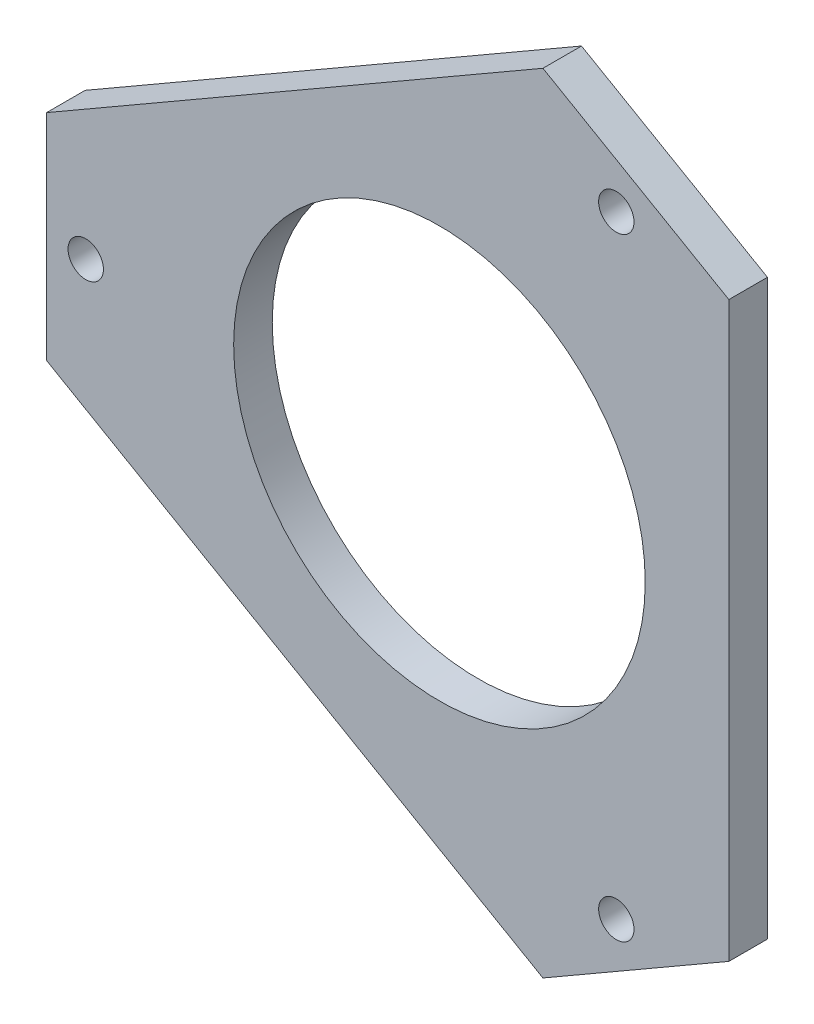
ISO-10303-21;
HEADER;
FILE_DESCRIPTION(('STEP AP214'),'2;1');
FILE_NAME('part.step','',(''),(''),'','','');
FILE_SCHEMA(('AUTOMOTIVE_DESIGN { 1 0 10303 214 1 1 1 1 }'));
ENDSEC;
DATA;
#1=APPLICATION_CONTEXT('core data for automotive mechanical design processes');
#2=APPLICATION_PROTOCOL_DEFINITION('international standard','automotive_design',2000,#1);
#3=PRODUCT_CONTEXT('',#1,'mechanical');
#4=PRODUCT('Part','Part','',(#3));
#5=PRODUCT_RELATED_PRODUCT_CATEGORY('part','',(#4));
#6=PRODUCT_DEFINITION_FORMATION('','',#4);
#7=PRODUCT_DEFINITION_CONTEXT('part definition',#1,'design');
#8=PRODUCT_DEFINITION('design','',#6,#7);
#9=PRODUCT_DEFINITION_SHAPE('','',#8);
#10=(LENGTH_UNIT() NAMED_UNIT(*) SI_UNIT(.MILLI.,.METRE.));
#11=(NAMED_UNIT(*) PLANE_ANGLE_UNIT() SI_UNIT($,.RADIAN.));
#12=(NAMED_UNIT(*) SI_UNIT($,.STERADIAN.) SOLID_ANGLE_UNIT());
#13=UNCERTAINTY_MEASURE_WITH_UNIT(LENGTH_MEASURE(1.E-05),#10,'distance_accuracy_value','');
#14=(GEOMETRIC_REPRESENTATION_CONTEXT(3) GLOBAL_UNCERTAINTY_ASSIGNED_CONTEXT((#13)) GLOBAL_UNIT_ASSIGNED_CONTEXT((#10,
#11,#12)) REPRESENTATION_CONTEXT('',''));
#15=CARTESIAN_POINT('',(0.,0.,0.));
#16=DIRECTION('',(0.,0.,1.));
#17=DIRECTION('',(1.,0.,0.));
#18=AXIS2_PLACEMENT_3D('',#15,#16,#17);
#19=CARTESIAN_POINT('',(-61.0910180612027,16.6906085043633,16.));
#20=DIRECTION('',(0.,0.,-1.));
#21=DIRECTION('',(-1.00000000000001,0.,0.));
#22=AXIS2_PLACEMENT_3D('',#19,#20,#21);
#23=PLANE('',#22);
#24=CARTESIAN_POINT('',(27.4999999999997,47.6313972081436,16.));
#25=DIRECTION('',(0.,0.,1.));
#26=DIRECTION('',(1.00000000000001,0.,0.));
#27=AXIS2_PLACEMENT_3D('',#24,#25,#26);
#28=CIRCLE('',#27,2.74999999999999);
#29=CARTESIAN_POINT('',(30.2499999999997,47.6313972081436,16.));
#30=VERTEX_POINT('',#29);
#31=EDGE_CURVE('E208',#30,#30,#28,.T.);
#32=ORIENTED_EDGE('',*,*,#31,.F.);
#33=EDGE_LOOP('',(#32));
#34=FACE_BOUND('',#33,.T.);
#35=CARTESIAN_POINT('',(0.,0.,16.));
#36=DIRECTION('',(0.,0.,1.));
#37=DIRECTION('',(1.00000000000001,0.,0.));
#38=AXIS2_PLACEMENT_3D('',#35,#36,#37);
#39=CIRCLE('',#38,32.);
#40=CARTESIAN_POINT('',(32.0000000000003,0.,16.));
#41=VERTEX_POINT('',#40);
#42=EDGE_CURVE('E145',#41,#41,#39,.T.);
#43=ORIENTED_EDGE('',*,*,#42,.F.);
#44=EDGE_LOOP('',(#43));
#45=FACE_BOUND('',#44,.T.);
#46=DIRECTION('',(0.,1.,0.));
#47=VECTOR('',#46,1.);
#48=CARTESIAN_POINT('',(-61.0910180612026,-16.6906085043628,16.));
#49=LINE('',#48,#47);
#50=CARTESIAN_POINT('',(-61.0910180612026,-16.6906085043628,16.));
#51=VERTEX_POINT('',#50);
#52=CARTESIAN_POINT('',(-61.0910180612027,16.6906085043633,16.));
#53=VERTEX_POINT('',#52);
#54=EDGE_CURVE('E156',#51,#53,#49,.T.);
#55=ORIENTED_EDGE('',*,*,#54,.F.);
#56=DIRECTION('',(-0.866025403784449,0.500000000000003,0.));
#57=VECTOR('',#56,1.);
#58=CARTESIAN_POINT('',(16.0910180612025,-61.2516778362366,15.9999999999995));
#59=LINE('',#58,#57);
#60=CARTESIAN_POINT('',(16.0910180612025,-61.2516778362366,15.9999999999995));
#61=VERTEX_POINT('',#60);
#62=EDGE_CURVE('E131',#61,#51,#59,.T.);
#63=ORIENTED_EDGE('',*,*,#62,.F.);
#64=DIRECTION('',(-0.866025403784444,-0.499999999999997,0.));
#65=VECTOR('',#64,1.);
#66=CARTESIAN_POINT('',(45.0000000000006,-44.5610693318735,16.));
#67=LINE('',#66,#65);
#68=CARTESIAN_POINT('',(45.0000000000006,-44.5610693318735,16.));
#69=VERTEX_POINT('',#68);
#70=EDGE_CURVE('E116',#69,#61,#67,.T.);
#71=ORIENTED_EDGE('',*,*,#70,.F.);
#72=DIRECTION('',(0.,-1.,0.));
#73=VECTOR('',#72,1.);
#74=CARTESIAN_POINT('',(45.0000000000004,44.5610693318734,16.0000000000005));
#75=LINE('',#74,#73);
#76=CARTESIAN_POINT('',(45.0000000000004,44.5610693318734,16.0000000000005));
#77=VERTEX_POINT('',#76);
#78=EDGE_CURVE('E129',#77,#69,#75,.T.);
#79=ORIENTED_EDGE('',*,*,#78,.F.);
#80=DIRECTION('',(0.866025403784453,-0.499999999999995,0.));
#81=VECTOR('',#80,1.);
#82=CARTESIAN_POINT('',(16.0910180612018,61.2516778362363,15.9999999999995));
#83=LINE('',#82,#81);
#84=CARTESIAN_POINT('',(16.0910180612018,61.2516778362363,15.9999999999995));
#85=VERTEX_POINT('',#84);
#86=EDGE_CURVE('E134',#85,#77,#83,.T.);
#87=ORIENTED_EDGE('',*,*,#86,.F.);
#88=DIRECTION('',(0.866025403784445,0.499999999999998,0.));
#89=VECTOR('',#88,1.);
#90=CARTESIAN_POINT('',(-61.0910180612027,16.6906085043633,16.));
#91=LINE('',#90,#89);
#92=EDGE_CURVE('E136',#53,#85,#91,.T.);
#93=ORIENTED_EDGE('',*,*,#92,.F.);
#94=EDGE_LOOP('',(#55,#63,#71,#79,#87,#93));
#95=FACE_BOUND('',#94,.T.);
#96=CARTESIAN_POINT('',(27.5000000000002,-47.6313972081436,16.));
#97=DIRECTION('',(0.,0.,1.));
#98=DIRECTION('',(1.00000000000001,0.,0.));
#99=AXIS2_PLACEMENT_3D('',#96,#97,#98);
#100=CIRCLE('',#99,2.74999999999999);
#101=CARTESIAN_POINT('',(30.2500000000002,-47.6313972081436,16.));
#102=VERTEX_POINT('',#101);
#103=EDGE_CURVE('E217',#102,#102,#100,.T.);
#104=ORIENTED_EDGE('',*,*,#103,.F.);
#105=EDGE_LOOP('',(#104));
#106=FACE_BOUND('',#105,.T.);
#107=CARTESIAN_POINT('',(-54.9999999999999,1.66533453693773E-13,16.));
#108=DIRECTION('',(0.,0.,1.));
#109=DIRECTION('',(1.00000000000001,0.,0.));
#110=AXIS2_PLACEMENT_3D('',#107,#108,#109);
#111=CIRCLE('',#110,2.74999999999999);
#112=CARTESIAN_POINT('',(-52.2499999999999,1.59205981731247E-13,16.));
#113=VERTEX_POINT('',#112);
#114=EDGE_CURVE('E204',#113,#113,#111,.T.);
#115=ORIENTED_EDGE('',*,*,#114,.F.);
#116=EDGE_LOOP('',(#115));
#117=FACE_BOUND('',#116,.T.);
#118=ADVANCED_FACE('F55',(#34,#45,#95,#106,#117),#23,.F.);
#119=CARTESIAN_POINT('',(-61.0910180612026,16.6906085043632,9.99999999999954));
#120=DIRECTION('',(0.,0.,-1.));
#121=DIRECTION('',(-1.00000000000001,0.,0.));
#122=AXIS2_PLACEMENT_3D('',#119,#120,#121);
#123=PLANE('',#122);
#124=CARTESIAN_POINT('',(-54.9999999999997,-1.11022302462516E-13,10.));
#125=DIRECTION('',(0.,0.,-1.));
#126=DIRECTION('',(-1.00000000000001,0.,0.));
#127=AXIS2_PLACEMENT_3D('',#124,#125,#126);
#128=CIRCLE('',#127,2.74999999999999);
#129=CARTESIAN_POINT('',(-57.7499999999998,-1.0369483049999E-13,10.));
#130=VERTEX_POINT('',#129);
#131=EDGE_CURVE('E207',#130,#130,#128,.T.);
#132=ORIENTED_EDGE('',*,*,#131,.F.);
#133=EDGE_LOOP('',(#132));
#134=FACE_BOUND('',#133,.T.);
#135=CARTESIAN_POINT('',(27.4999999999996,47.6313972081436,10.));
#136=DIRECTION('',(0.,0.,-1.));
#137=DIRECTION('',(-1.00000000000001,0.,0.));
#138=AXIS2_PLACEMENT_3D('',#135,#136,#137);
#139=CIRCLE('',#138,2.74999999999999);
#140=CARTESIAN_POINT('',(24.7499999999995,47.6313972081436,10.));
#141=VERTEX_POINT('',#140);
#142=EDGE_CURVE('E211',#141,#141,#139,.T.);
#143=ORIENTED_EDGE('',*,*,#142,.F.);
#144=EDGE_LOOP('',(#143));
#145=FACE_BOUND('',#144,.T.);
#146=CARTESIAN_POINT('',(27.5000000000002,-47.6313972081434,10.));
#147=DIRECTION('',(0.,0.,-1.));
#148=DIRECTION('',(-1.00000000000001,0.,0.));
#149=AXIS2_PLACEMENT_3D('',#146,#147,#148);
#150=CIRCLE('',#149,2.74999999999999);
#151=CARTESIAN_POINT('',(24.7500000000002,-47.6313972081434,10.));
#152=VERTEX_POINT('',#151);
#153=EDGE_CURVE('E220',#152,#152,#150,.T.);
#154=ORIENTED_EDGE('',*,*,#153,.F.);
#155=EDGE_LOOP('',(#154));
#156=FACE_BOUND('',#155,.T.);
#157=DIRECTION('',(0.,1.,0.));
#158=VECTOR('',#157,1.);
#159=CARTESIAN_POINT('',(-61.0910180612025,-16.6906085043628,10.));
#160=LINE('',#159,#158);
#161=CARTESIAN_POINT('',(-61.0910180612025,-16.6906085043628,10.));
#162=VERTEX_POINT('',#161);
#163=CARTESIAN_POINT('',(-61.0910180612026,16.6906085043632,9.99999999999954));
#164=VERTEX_POINT('',#163);
#165=EDGE_CURVE('E141',#162,#164,#160,.T.);
#166=ORIENTED_EDGE('',*,*,#165,.T.);
#167=DIRECTION('',(0.866025403784445,0.499999999999998,0.));
#168=VECTOR('',#167,1.);
#169=CARTESIAN_POINT('',(-61.0910180612026,16.6906085043632,9.99999999999954));
#170=LINE('',#169,#168);
#171=CARTESIAN_POINT('',(16.0910180612017,61.2516778362363,9.99999999999954));
#172=VERTEX_POINT('',#171);
#173=EDGE_CURVE('E144',#164,#172,#170,.T.);
#174=ORIENTED_EDGE('',*,*,#173,.T.);
#175=DIRECTION('',(0.866025403784453,-0.499999999999995,0.));
#176=VECTOR('',#175,1.);
#177=CARTESIAN_POINT('',(16.0910180612017,61.2516778362363,9.99999999999954));
#178=LINE('',#177,#176);
#179=CARTESIAN_POINT('',(45.0000000000003,44.5610693318735,10.0000000000005));
#180=VERTEX_POINT('',#179);
#181=EDGE_CURVE('E148',#172,#180,#178,.T.);
#182=ORIENTED_EDGE('',*,*,#181,.T.);
#183=DIRECTION('',(0.,-1.,0.));
#184=VECTOR('',#183,1.);
#185=CARTESIAN_POINT('',(45.0000000000003,44.5610693318735,10.0000000000005));
#186=LINE('',#185,#184);
#187=CARTESIAN_POINT('',(45.0000000000007,-44.5610693318734,9.99999999999995));
#188=VERTEX_POINT('',#187);
#189=EDGE_CURVE('E151',#180,#188,#186,.T.);
#190=ORIENTED_EDGE('',*,*,#189,.T.);
#191=DIRECTION('',(-0.866025403784444,-0.499999999999997,0.));
#192=VECTOR('',#191,1.);
#193=CARTESIAN_POINT('',(45.0000000000007,-44.5610693318734,9.99999999999995));
#194=LINE('',#193,#192);
#195=CARTESIAN_POINT('',(16.0910180612025,-61.2516778362367,9.99999999999954));
#196=VERTEX_POINT('',#195);
#197=EDGE_CURVE('E118',#188,#196,#194,.T.);
#198=ORIENTED_EDGE('',*,*,#197,.T.);
#199=DIRECTION('',(-0.866025403784449,0.500000000000003,0.));
#200=VECTOR('',#199,1.);
#201=CARTESIAN_POINT('',(16.0910180612025,-61.2516778362367,9.99999999999954));
#202=LINE('',#201,#200);
#203=EDGE_CURVE('E154',#196,#162,#202,.T.);
#204=ORIENTED_EDGE('',*,*,#203,.T.);
#205=EDGE_LOOP('',(#166,#174,#182,#190,#198,#204));
#206=FACE_BOUND('',#205,.T.);
#207=CARTESIAN_POINT('',(0.,0.,10.));
#208=DIRECTION('',(0.,0.,1.));
#209=DIRECTION('',(1.00000000000001,0.,0.));
#210=AXIS2_PLACEMENT_3D('',#207,#208,#209);
#211=CIRCLE('',#210,32.);
#212=CARTESIAN_POINT('',(32.0000000000003,-1.26898491714655E-13,10.));
#213=VERTEX_POINT('',#212);
#214=EDGE_CURVE('E223',#213,#213,#211,.T.);
#215=ORIENTED_EDGE('',*,*,#214,.T.);
#216=EDGE_LOOP('',(#215));
#217=FACE_BOUND('',#216,.T.);
#218=ADVANCED_FACE('F163',(#134,#145,#156,#206,#217),#123,.T.);
#219=CARTESIAN_POINT('',(-61.0910180612026,-16.6906085043628,16.));
#220=DIRECTION('',(-1.00000000000001,0.,0.));
#221=DIRECTION('',(0.,0.,1.));
#222=AXIS2_PLACEMENT_3D('',#219,#220,#221);
#223=PLANE('',#222);
#224=ORIENTED_EDGE('',*,*,#165,.F.);
#225=DIRECTION('',(0.,0.,-1.));
#226=VECTOR('',#225,1.);
#227=CARTESIAN_POINT('',(-61.0910180612026,-16.6906085043628,16.));
#228=LINE('',#227,#226);
#229=EDGE_CURVE('E12',#51,#162,#228,.T.);
#230=ORIENTED_EDGE('',*,*,#229,.F.);
#231=ORIENTED_EDGE('',*,*,#54,.T.);
#232=DIRECTION('',(0.,0.,-1.));
#233=VECTOR('',#232,1.);
#234=CARTESIAN_POINT('',(-61.0910180612027,16.6906085043633,16.));
#235=LINE('',#234,#233);
#236=EDGE_CURVE('E59',#53,#164,#235,.T.);
#237=ORIENTED_EDGE('',*,*,#236,.T.);
#238=EDGE_LOOP('',(#224,#230,#231,#237));
#239=FACE_BOUND('',#238,.T.);
#240=ADVANCED_FACE('F57',(#239),#223,.T.);
#241=CARTESIAN_POINT('',(16.0910180612025,-61.2516778362366,15.9999999999995));
#242=DIRECTION('',(-0.500000000000003,-0.866025403784437,0.));
#243=DIRECTION('',(0.866025403784449,-0.500000000000003,0.));
#244=AXIS2_PLACEMENT_3D('',#241,#242,#243);
#245=PLANE('',#244);
#246=ORIENTED_EDGE('',*,*,#203,.F.);
#247=DIRECTION('',(0.,0.,-1.));
#248=VECTOR('',#247,1.);
#249=CARTESIAN_POINT('',(16.0910180612025,-61.2516778362366,15.9999999999995));
#250=LINE('',#249,#248);
#251=EDGE_CURVE('E65',#61,#196,#250,.T.);
#252=ORIENTED_EDGE('',*,*,#251,.F.);
#253=ORIENTED_EDGE('',*,*,#62,.T.);
#254=ORIENTED_EDGE('',*,*,#229,.T.);
#255=EDGE_LOOP('',(#246,#252,#253,#254));
#256=FACE_BOUND('',#255,.T.);
#257=ADVANCED_FACE('F165',(#256),#245,.T.);
#258=CARTESIAN_POINT('',(45.0000000000006,-44.5610693318735,16.));
#259=DIRECTION('',(0.500000000000007,-0.866025403784441,0.));
#260=DIRECTION('',(0.866025403784445,0.499999999999997,0.));
#261=AXIS2_PLACEMENT_3D('',#258,#259,#260);
#262=PLANE('',#261);
#263=ORIENTED_EDGE('',*,*,#197,.F.);
#264=DIRECTION('',(0.,0.,-1.));
#265=VECTOR('',#264,1.);
#266=CARTESIAN_POINT('',(45.0000000000006,-44.5610693318735,16.));
#267=LINE('',#266,#265);
#268=EDGE_CURVE('E113',#69,#188,#267,.T.);
#269=ORIENTED_EDGE('',*,*,#268,.F.);
#270=ORIENTED_EDGE('',*,*,#70,.T.);
#271=ORIENTED_EDGE('',*,*,#251,.T.);
#272=EDGE_LOOP('',(#263,#269,#270,#271));
#273=FACE_BOUND('',#272,.T.);
#274=ADVANCED_FACE('F115',(#273),#262,.T.);
#275=CARTESIAN_POINT('',(45.0000000000004,44.5610693318734,16.0000000000005));
#276=DIRECTION('',(1.00000000000001,0.,0.));
#277=DIRECTION('',(0.,0.,-1.));
#278=AXIS2_PLACEMENT_3D('',#275,#276,#277);
#279=PLANE('',#278);
#280=ORIENTED_EDGE('',*,*,#189,.F.);
#281=DIRECTION('',(0.,0.,-1.));
#282=VECTOR('',#281,1.);
#283=CARTESIAN_POINT('',(45.0000000000004,44.5610693318734,16.0000000000005));
#284=LINE('',#283,#282);
#285=EDGE_CURVE('E123',#77,#180,#284,.T.);
#286=ORIENTED_EDGE('',*,*,#285,.F.);
#287=ORIENTED_EDGE('',*,*,#78,.T.);
#288=ORIENTED_EDGE('',*,*,#268,.T.);
#289=EDGE_LOOP('',(#280,#286,#287,#288));
#290=FACE_BOUND('',#289,.T.);
#291=ADVANCED_FACE('F133',(#290),#279,.T.);
#292=CARTESIAN_POINT('',(16.0910180612018,61.2516778362363,15.9999999999995));
#293=DIRECTION('',(0.499999999999993,0.866025403784443,0.));
#294=DIRECTION('',(-0.866025403784453,0.499999999999995,0.));
#295=AXIS2_PLACEMENT_3D('',#292,#293,#294);
#296=PLANE('',#295);
#297=ORIENTED_EDGE('',*,*,#181,.F.);
#298=DIRECTION('',(0.,0.,-1.));
#299=VECTOR('',#298,1.);
#300=CARTESIAN_POINT('',(16.0910180612018,61.2516778362363,15.9999999999995));
#301=LINE('',#300,#299);
#302=EDGE_CURVE('E159',#85,#172,#301,.T.);
#303=ORIENTED_EDGE('',*,*,#302,.F.);
#304=ORIENTED_EDGE('',*,*,#86,.T.);
#305=ORIENTED_EDGE('',*,*,#285,.T.);
#306=EDGE_LOOP('',(#297,#303,#304,#305));
#307=FACE_BOUND('',#306,.T.);
#308=ADVANCED_FACE('F229',(#307),#296,.T.);
#309=CARTESIAN_POINT('',(-61.0910180612027,16.6906085043633,16.));
#310=DIRECTION('',(-0.500000000000007,0.86602540378444,0.));
#311=DIRECTION('',(-0.866025403784445,-0.499999999999998,0.));
#312=AXIS2_PLACEMENT_3D('',#309,#310,#311);
#313=PLANE('',#312);
#314=ORIENTED_EDGE('',*,*,#173,.F.);
#315=ORIENTED_EDGE('',*,*,#236,.F.);
#316=ORIENTED_EDGE('',*,*,#92,.T.);
#317=ORIENTED_EDGE('',*,*,#302,.T.);
#318=EDGE_LOOP('',(#314,#315,#316,#317));
#319=FACE_BOUND('',#318,.T.);
#320=ADVANCED_FACE('F161',(#319),#313,.T.);
#321=CARTESIAN_POINT('',(0.,0.,16.));
#322=DIRECTION('',(0.,0.,-1.));
#323=DIRECTION('',(-1.00000000000001,0.,0.));
#324=AXIS2_PLACEMENT_3D('',#321,#322,#323);
#325=CYLINDRICAL_SURFACE('',#324,32.);
#326=ORIENTED_EDGE('',*,*,#42,.T.);
#327=EDGE_LOOP('',(#326));
#328=FACE_BOUND('',#327,.T.);
#329=ORIENTED_EDGE('',*,*,#214,.F.);
#330=EDGE_LOOP('',(#329));
#331=FACE_BOUND('',#330,.T.);
#332=ADVANCED_FACE('F184',(#328,#331),#325,.F.);
#333=CARTESIAN_POINT('',(27.5000000000002,-47.6313972081436,16.));
#334=DIRECTION('',(0.,0.,1.));
#335=DIRECTION('',(1.00000000000001,0.,0.));
#336=AXIS2_PLACEMENT_3D('',#333,#334,#335);
#337=CYLINDRICAL_SURFACE('',#336,2.74999999999999);
#338=ORIENTED_EDGE('',*,*,#103,.T.);
#339=EDGE_LOOP('',(#338));
#340=FACE_BOUND('',#339,.T.);
#341=ORIENTED_EDGE('',*,*,#153,.T.);
#342=EDGE_LOOP('',(#341));
#343=FACE_BOUND('',#342,.T.);
#344=ADVANCED_FACE('F187',(#340,#343),#337,.F.);
#345=CARTESIAN_POINT('',(27.4999999999997,47.6313972081436,16.));
#346=DIRECTION('',(0.,0.,1.));
#347=DIRECTION('',(1.00000000000001,0.,0.));
#348=AXIS2_PLACEMENT_3D('',#345,#346,#347);
#349=CYLINDRICAL_SURFACE('',#348,2.74999999999999);
#350=ORIENTED_EDGE('',*,*,#31,.T.);
#351=EDGE_LOOP('',(#350));
#352=FACE_BOUND('',#351,.T.);
#353=ORIENTED_EDGE('',*,*,#142,.T.);
#354=EDGE_LOOP('',(#353));
#355=FACE_BOUND('',#354,.T.);
#356=ADVANCED_FACE('F191',(#352,#355),#349,.F.);
#357=CARTESIAN_POINT('',(-54.9999999999999,1.66533453693773E-13,16.));
#358=DIRECTION('',(0.,0.,1.));
#359=DIRECTION('',(1.00000000000001,0.,0.));
#360=AXIS2_PLACEMENT_3D('',#357,#358,#359);
#361=CYLINDRICAL_SURFACE('',#360,2.74999999999999);
#362=ORIENTED_EDGE('',*,*,#114,.T.);
#363=EDGE_LOOP('',(#362));
#364=FACE_BOUND('',#363,.T.);
#365=ORIENTED_EDGE('',*,*,#131,.T.);
#366=EDGE_LOOP('',(#365));
#367=FACE_BOUND('',#366,.T.);
#368=ADVANCED_FACE('F195',(#364,#367),#361,.F.);
#369=CLOSED_SHELL('',(#118,#218,#240,#257,#274,#291,#308,#320,#332,#344,#356,#368));
#370=MANIFOLD_SOLID_BREP('B2',#369);
#371=ADVANCED_BREP_SHAPE_REPRESENTATION('',(#18,#370),#14);
#372=SHAPE_DEFINITION_REPRESENTATION(#9,#371);
ENDSEC;
END-ISO-10303-21;
